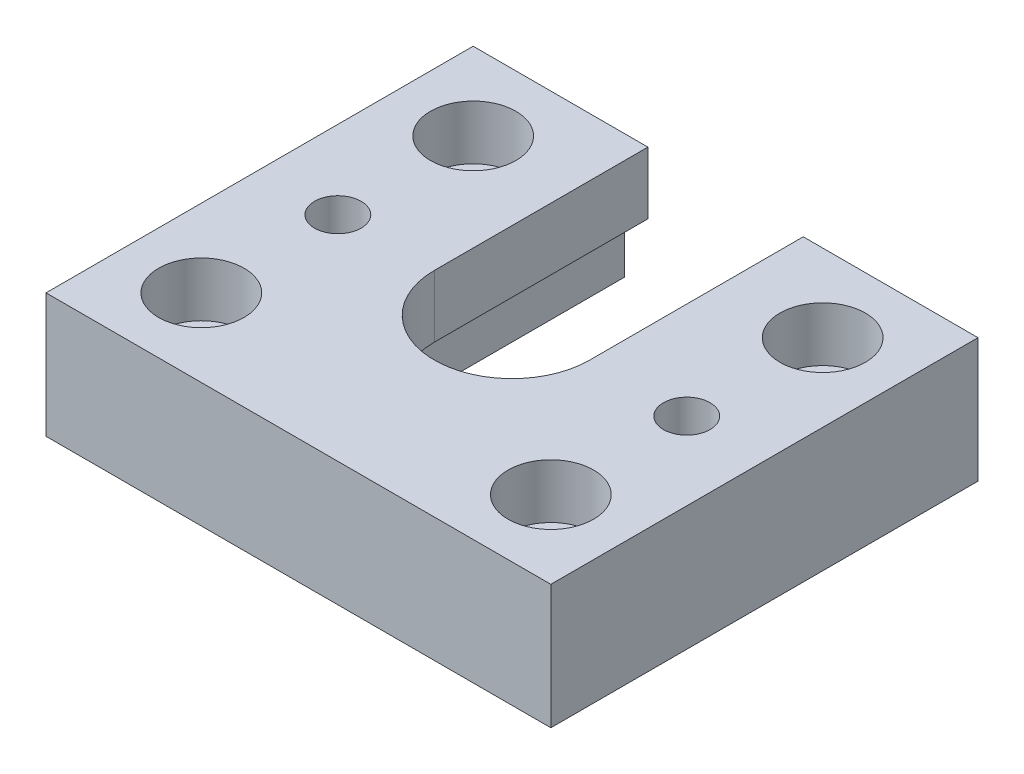
ISO-10303-21;
HEADER;
FILE_DESCRIPTION(('STEP AP214'),'2;1');
FILE_NAME('part.step','',(''),(''),'','','');
FILE_SCHEMA(('AUTOMOTIVE_DESIGN { 1 0 10303 214 1 1 1 1 }'));
ENDSEC;
DATA;
#1=APPLICATION_CONTEXT('core data for automotive mechanical design processes');
#2=APPLICATION_PROTOCOL_DEFINITION('international standard','automotive_design',2000,#1);
#3=PRODUCT_CONTEXT('',#1,'mechanical');
#4=PRODUCT('Part','Part','',(#3));
#5=PRODUCT_RELATED_PRODUCT_CATEGORY('part','',(#4));
#6=PRODUCT_DEFINITION_FORMATION('','',#4);
#7=PRODUCT_DEFINITION_CONTEXT('part definition',#1,'design');
#8=PRODUCT_DEFINITION('design','',#6,#7);
#9=PRODUCT_DEFINITION_SHAPE('','',#8);
#10=(LENGTH_UNIT() NAMED_UNIT(*) SI_UNIT(.MILLI.,.METRE.));
#11=(NAMED_UNIT(*) PLANE_ANGLE_UNIT() SI_UNIT($,.RADIAN.));
#12=(NAMED_UNIT(*) SI_UNIT($,.STERADIAN.) SOLID_ANGLE_UNIT());
#13=UNCERTAINTY_MEASURE_WITH_UNIT(LENGTH_MEASURE(1.E-05),#10,'distance_accuracy_value','');
#14=(GEOMETRIC_REPRESENTATION_CONTEXT(3) GLOBAL_UNCERTAINTY_ASSIGNED_CONTEXT((#13)) GLOBAL_UNIT_ASSIGNED_CONTEXT((#10,
#11,#12)) REPRESENTATION_CONTEXT('',''));
#15=CARTESIAN_POINT('',(0.,0.,0.));
#16=DIRECTION('',(0.,0.,1.));
#17=DIRECTION('',(1.,0.,0.));
#18=AXIS2_PLACEMENT_3D('',#15,#16,#17);
#19=CARTESIAN_POINT('',(0.,16.,-55.));
#20=DIRECTION('',(0.,0.,1.));
#21=DIRECTION('',(1.,0.,0.));
#22=AXIS2_PLACEMENT_3D('',#19,#20,#21);
#23=PLANE('',#22);
#24=DIRECTION('',(0.,-1.,0.));
#25=VECTOR('',#24,1.);
#26=CARTESIAN_POINT('',(42.5,16.,-55.));
#27=LINE('',#26,#25);
#28=CARTESIAN_POINT('',(42.5,16.,-55.));
#29=VERTEX_POINT('',#28);
#30=CARTESIAN_POINT('',(42.5,8.,-55.));
#31=VERTEX_POINT('',#30);
#32=EDGE_CURVE('E166',#29,#31,#27,.T.);
#33=ORIENTED_EDGE('',*,*,#32,.F.);
#34=DIRECTION('',(-1.,0.,0.));
#35=VECTOR('',#34,1.);
#36=CARTESIAN_POINT('',(0.,16.,-55.));
#37=LINE('',#36,#35);
#38=CARTESIAN_POINT('',(65.,16.,-55.));
#39=VERTEX_POINT('',#38);
#40=EDGE_CURVE('E303',#39,#29,#37,.T.);
#41=ORIENTED_EDGE('',*,*,#40,.F.);
#42=DIRECTION('',(0.,-1.,0.));
#43=VECTOR('',#42,1.);
#44=CARTESIAN_POINT('',(65.,16.,-55.));
#45=LINE('',#44,#43);
#46=CARTESIAN_POINT('',(65.,0.,-55.));
#47=VERTEX_POINT('',#46);
#48=EDGE_CURVE('E323',#39,#47,#45,.T.);
#49=ORIENTED_EDGE('',*,*,#48,.T.);
#50=DIRECTION('',(-1.,0.,0.));
#51=VECTOR('',#50,1.);
#52=CARTESIAN_POINT('',(0.,0.,-55.));
#53=LINE('',#52,#51);
#54=CARTESIAN_POINT('',(45.5,0.,-55.));
#55=VERTEX_POINT('',#54);
#56=EDGE_CURVE('E296',#47,#55,#53,.T.);
#57=ORIENTED_EDGE('',*,*,#56,.T.);
#58=DIRECTION('',(0.,-1.,0.));
#59=VECTOR('',#58,1.);
#60=CARTESIAN_POINT('',(45.5,8.,-55.));
#61=LINE('',#60,#59);
#62=CARTESIAN_POINT('',(45.5,8.,-55.));
#63=VERTEX_POINT('',#62);
#64=EDGE_CURVE('E198',#63,#55,#61,.T.);
#65=ORIENTED_EDGE('',*,*,#64,.F.);
#66=DIRECTION('',(1.,0.,0.));
#67=VECTOR('',#66,1.);
#68=CARTESIAN_POINT('',(0.,8.,-55.));
#69=LINE('',#68,#67);
#70=EDGE_CURVE('E184',#31,#63,#69,.T.);
#71=ORIENTED_EDGE('',*,*,#70,.F.);
#72=EDGE_LOOP('',(#33,#41,#49,#57,#65,#71));
#73=FACE_BOUND('',#72,.T.);
#74=ADVANCED_FACE('F39',(#73),#23,.F.);
#75=CARTESIAN_POINT('',(0.,16.,0.));
#76=DIRECTION('',(0.,-1.,0.));
#77=DIRECTION('',(0.,0.,-1.));
#78=AXIS2_PLACEMENT_3D('',#75,#76,#77);
#79=PLANE('',#78);
#80=CARTESIAN_POINT('',(10.,16.,-9.99999999999999));
#81=DIRECTION('',(0.,1.,0.));
#82=DIRECTION('',(0.,0.,1.));
#83=AXIS2_PLACEMENT_3D('',#80,#81,#82);
#84=CIRCLE('',#83,5.5);
#85=CARTESIAN_POINT('',(10.,16.,-4.5));
#86=VERTEX_POINT('',#85);
#87=EDGE_CURVE('E274',#86,#86,#84,.T.);
#88=ORIENTED_EDGE('',*,*,#87,.F.);
#89=EDGE_LOOP('',(#88));
#90=FACE_BOUND('',#89,.T.);
#91=CARTESIAN_POINT('',(55.,16.,-9.99999999999999));
#92=DIRECTION('',(0.,1.,0.));
#93=DIRECTION('',(0.,0.,1.));
#94=AXIS2_PLACEMENT_3D('',#91,#92,#93);
#95=CIRCLE('',#94,5.5);
#96=CARTESIAN_POINT('',(55.,16.,-4.5));
#97=VERTEX_POINT('',#96);
#98=EDGE_CURVE('E258',#97,#97,#95,.T.);
#99=ORIENTED_EDGE('',*,*,#98,.F.);
#100=EDGE_LOOP('',(#99));
#101=FACE_BOUND('',#100,.T.);
#102=CARTESIAN_POINT('',(55.,16.,-45.));
#103=DIRECTION('',(0.,1.,0.));
#104=DIRECTION('',(0.,0.,1.));
#105=AXIS2_PLACEMENT_3D('',#102,#103,#104);
#106=CIRCLE('',#105,5.5);
#107=CARTESIAN_POINT('',(55.,16.,-39.5));
#108=VERTEX_POINT('',#107);
#109=EDGE_CURVE('E242',#108,#108,#106,.T.);
#110=ORIENTED_EDGE('',*,*,#109,.F.);
#111=EDGE_LOOP('',(#110));
#112=FACE_BOUND('',#111,.T.);
#113=CARTESIAN_POINT('',(10.,16.,-45.));
#114=DIRECTION('',(0.,1.,0.));
#115=DIRECTION('',(0.,0.,1.));
#116=AXIS2_PLACEMENT_3D('',#113,#114,#115);
#117=CIRCLE('',#116,5.5);
#118=CARTESIAN_POINT('',(10.,16.,-39.5));
#119=VERTEX_POINT('',#118);
#120=EDGE_CURVE('E226',#119,#119,#117,.T.);
#121=ORIENTED_EDGE('',*,*,#120,.F.);
#122=EDGE_LOOP('',(#121));
#123=FACE_BOUND('',#122,.T.);
#124=CARTESIAN_POINT('',(55.,16.,-27.5));
#125=DIRECTION('',(0.,1.,0.));
#126=DIRECTION('',(0.,0.,1.));
#127=AXIS2_PLACEMENT_3D('',#124,#125,#126);
#128=CIRCLE('',#127,3.);
#129=CARTESIAN_POINT('',(55.,16.,-24.5));
#130=VERTEX_POINT('',#129);
#131=EDGE_CURVE('E218',#130,#130,#128,.T.);
#132=ORIENTED_EDGE('',*,*,#131,.F.);
#133=EDGE_LOOP('',(#132));
#134=FACE_BOUND('',#133,.T.);
#135=CARTESIAN_POINT('',(10.0781163253014,16.,-27.5));
#136=DIRECTION('',(0.,1.,0.));
#137=DIRECTION('',(0.,0.,1.));
#138=AXIS2_PLACEMENT_3D('',#135,#136,#137);
#139=CIRCLE('',#138,3.);
#140=CARTESIAN_POINT('',(10.0781163253014,16.,-24.5));
#141=VERTEX_POINT('',#140);
#142=EDGE_CURVE('E201',#141,#141,#139,.T.);
#143=ORIENTED_EDGE('',*,*,#142,.F.);
#144=EDGE_LOOP('',(#143));
#145=FACE_BOUND('',#144,.T.);
#146=DIRECTION('',(0.,0.,-1.));
#147=VECTOR('',#146,1.);
#148=CARTESIAN_POINT('',(42.5,16.,0.));
#149=LINE('',#148,#147);
#150=CARTESIAN_POINT('',(42.5,16.,-27.5));
#151=VERTEX_POINT('',#150);
#152=EDGE_CURVE('E137',#151,#29,#149,.T.);
#153=ORIENTED_EDGE('',*,*,#152,.F.);
#154=CARTESIAN_POINT('',(32.5,16.,-27.5));
#155=DIRECTION('',(0.,-1.,0.));
#156=DIRECTION('',(0.,0.,-1.));
#157=AXIS2_PLACEMENT_3D('',#154,#155,#156);
#158=CIRCLE('',#157,10.);
#159=CARTESIAN_POINT('',(22.5,16.,-27.5));
#160=VERTEX_POINT('',#159);
#161=EDGE_CURVE('E131',#151,#160,#158,.T.);
#162=ORIENTED_EDGE('',*,*,#161,.T.);
#163=DIRECTION('',(0.,0.,-1.));
#164=VECTOR('',#163,1.);
#165=CARTESIAN_POINT('',(22.5,16.,0.));
#166=LINE('',#165,#164);
#167=CARTESIAN_POINT('',(22.5,16.,-55.));
#168=VERTEX_POINT('',#167);
#169=EDGE_CURVE('E140',#160,#168,#166,.T.);
#170=ORIENTED_EDGE('',*,*,#169,.T.);
#171=CARTESIAN_POINT('',(0.,16.,-55.));
#172=VERTEX_POINT('',#171);
#173=EDGE_CURVE('E302',#168,#172,#37,.T.);
#174=ORIENTED_EDGE('',*,*,#173,.T.);
#175=DIRECTION('',(0.,0.,1.));
#176=VECTOR('',#175,1.);
#177=CARTESIAN_POINT('',(0.,16.,0.));
#178=LINE('',#177,#176);
#179=CARTESIAN_POINT('',(0.,16.,0.));
#180=VERTEX_POINT('',#179);
#181=EDGE_CURVE('E291',#172,#180,#178,.T.);
#182=ORIENTED_EDGE('',*,*,#181,.T.);
#183=DIRECTION('',(1.,0.,0.));
#184=VECTOR('',#183,1.);
#185=CARTESIAN_POINT('',(0.,16.,0.));
#186=LINE('',#185,#184);
#187=CARTESIAN_POINT('',(65.,16.,0.));
#188=VERTEX_POINT('',#187);
#189=EDGE_CURVE('E295',#180,#188,#186,.T.);
#190=ORIENTED_EDGE('',*,*,#189,.T.);
#191=DIRECTION('',(0.,0.,-1.));
#192=VECTOR('',#191,1.);
#193=CARTESIAN_POINT('',(65.,16.,0.));
#194=LINE('',#193,#192);
#195=EDGE_CURVE('E299',#188,#39,#194,.T.);
#196=ORIENTED_EDGE('',*,*,#195,.T.);
#197=ORIENTED_EDGE('',*,*,#40,.T.);
#198=EDGE_LOOP('',(#153,#162,#170,#174,#182,#190,#196,#197));
#199=FACE_BOUND('',#198,.T.);
#200=ADVANCED_FACE('F147',(#90,#101,#112,#123,#134,#145,#199),#79,.F.);
#201=CARTESIAN_POINT('',(0.,8.,0.));
#202=DIRECTION('',(0.,-1.,0.));
#203=DIRECTION('',(0.,0.,-1.));
#204=AXIS2_PLACEMENT_3D('',#201,#202,#203);
#205=PLANE('',#204);
#206=CARTESIAN_POINT('',(32.5,8.,-27.5));
#207=DIRECTION('',(0.,-1.,0.));
#208=DIRECTION('',(0.,0.,-1.));
#209=AXIS2_PLACEMENT_3D('',#206,#207,#208);
#210=CIRCLE('',#209,10.);
#211=CARTESIAN_POINT('',(42.5,8.,-27.5));
#212=VERTEX_POINT('',#211);
#213=CARTESIAN_POINT('',(22.5,8.,-27.5));
#214=VERTEX_POINT('',#213);
#215=EDGE_CURVE('E55',#212,#214,#210,.T.);
#216=ORIENTED_EDGE('',*,*,#215,.F.);
#217=DIRECTION('',(0.,0.,-1.));
#218=VECTOR('',#217,1.);
#219=CARTESIAN_POINT('',(42.5,8.,0.));
#220=LINE('',#219,#218);
#221=EDGE_CURVE('E150',#212,#31,#220,.T.);
#222=ORIENTED_EDGE('',*,*,#221,.T.);
#223=ORIENTED_EDGE('',*,*,#70,.T.);
#224=DIRECTION('',(0.,0.,-1.));
#225=VECTOR('',#224,1.);
#226=CARTESIAN_POINT('',(45.5,8.,0.));
#227=LINE('',#226,#225);
#228=CARTESIAN_POINT('',(45.5,8.,-27.5));
#229=VERTEX_POINT('',#228);
#230=EDGE_CURVE('E171',#229,#63,#227,.T.);
#231=ORIENTED_EDGE('',*,*,#230,.F.);
#232=CARTESIAN_POINT('',(32.5,8.,-27.5));
#233=DIRECTION('',(0.,-1.,0.));
#234=DIRECTION('',(0.,0.,-1.));
#235=AXIS2_PLACEMENT_3D('',#232,#233,#234);
#236=CIRCLE('',#235,13.);
#237=CARTESIAN_POINT('',(19.5,8.,-27.5));
#238=VERTEX_POINT('',#237);
#239=EDGE_CURVE('E175',#229,#238,#236,.T.);
#240=ORIENTED_EDGE('',*,*,#239,.T.);
#241=DIRECTION('',(0.,0.,-1.));
#242=VECTOR('',#241,1.);
#243=CARTESIAN_POINT('',(19.5,8.,0.));
#244=LINE('',#243,#242);
#245=CARTESIAN_POINT('',(19.5,8.,-55.));
#246=VERTEX_POINT('',#245);
#247=EDGE_CURVE('E180',#238,#246,#244,.T.);
#248=ORIENTED_EDGE('',*,*,#247,.T.);
#249=CARTESIAN_POINT('',(22.5,8.,-55.));
#250=VERTEX_POINT('',#249);
#251=EDGE_CURVE('E185',#246,#250,#69,.T.);
#252=ORIENTED_EDGE('',*,*,#251,.T.);
#253=DIRECTION('',(0.,0.,-1.));
#254=VECTOR('',#253,1.);
#255=CARTESIAN_POINT('',(22.5,8.,0.));
#256=LINE('',#255,#254);
#257=EDGE_CURVE('E154',#214,#250,#256,.T.);
#258=ORIENTED_EDGE('',*,*,#257,.F.);
#259=EDGE_LOOP('',(#216,#222,#223,#231,#240,#248,#252,#258));
#260=FACE_BOUND('',#259,.T.);
#261=ADVANCED_FACE('F357',(#260),#205,.T.);
#262=ORIENTED_EDGE('',*,*,#173,.F.);
#263=DIRECTION('',(0.,-1.,0.));
#264=VECTOR('',#263,1.);
#265=CARTESIAN_POINT('',(22.5,16.,-55.));
#266=LINE('',#265,#264);
#267=EDGE_CURVE('E136',#168,#250,#266,.T.);
#268=ORIENTED_EDGE('',*,*,#267,.T.);
#269=ORIENTED_EDGE('',*,*,#251,.F.);
#270=DIRECTION('',(0.,-1.,0.));
#271=VECTOR('',#270,1.);
#272=CARTESIAN_POINT('',(19.5,8.,-55.));
#273=LINE('',#272,#271);
#274=CARTESIAN_POINT('',(19.5,0.,-55.));
#275=VERTEX_POINT('',#274);
#276=EDGE_CURVE('E202',#246,#275,#273,.T.);
#277=ORIENTED_EDGE('',*,*,#276,.T.);
#278=CARTESIAN_POINT('',(0.,0.,-55.));
#279=VERTEX_POINT('',#278);
#280=EDGE_CURVE('E316',#275,#279,#53,.T.);
#281=ORIENTED_EDGE('',*,*,#280,.T.);
#282=DIRECTION('',(0.,-1.,0.));
#283=VECTOR('',#282,1.);
#284=CARTESIAN_POINT('',(0.,16.,-55.));
#285=LINE('',#284,#283);
#286=EDGE_CURVE('E306',#172,#279,#285,.T.);
#287=ORIENTED_EDGE('',*,*,#286,.F.);
#288=EDGE_LOOP('',(#262,#268,#269,#277,#281,#287));
#289=FACE_BOUND('',#288,.T.);
#290=ADVANCED_FACE('F366',(#289),#23,.F.);
#291=CARTESIAN_POINT('',(0.,0.,0.));
#292=DIRECTION('',(0.,-1.,0.));
#293=DIRECTION('',(0.,0.,-1.));
#294=AXIS2_PLACEMENT_3D('',#291,#292,#293);
#295=PLANE('',#294);
#296=CARTESIAN_POINT('',(10.0781163253014,0.,-27.5));
#297=DIRECTION('',(0.,1.,0.));
#298=DIRECTION('',(0.,0.,1.));
#299=AXIS2_PLACEMENT_3D('',#296,#297,#298);
#300=CIRCLE('',#299,3.);
#301=CARTESIAN_POINT('',(10.0781163253014,0.,-24.5));
#302=VERTEX_POINT('',#301);
#303=EDGE_CURVE('E214',#302,#302,#300,.T.);
#304=ORIENTED_EDGE('',*,*,#303,.T.);
#305=EDGE_LOOP('',(#304));
#306=FACE_BOUND('',#305,.T.);
#307=CARTESIAN_POINT('',(55.,0.,-27.5));
#308=DIRECTION('',(0.,1.,0.));
#309=DIRECTION('',(0.,0.,1.));
#310=AXIS2_PLACEMENT_3D('',#307,#308,#309);
#311=CIRCLE('',#310,3.);
#312=CARTESIAN_POINT('',(55.,0.,-24.5));
#313=VERTEX_POINT('',#312);
#314=EDGE_CURVE('E222',#313,#313,#311,.T.);
#315=ORIENTED_EDGE('',*,*,#314,.T.);
#316=EDGE_LOOP('',(#315));
#317=FACE_BOUND('',#316,.T.);
#318=CARTESIAN_POINT('',(10.,0.,-45.));
#319=DIRECTION('',(0.,1.,0.));
#320=DIRECTION('',(0.,0.,1.));
#321=AXIS2_PLACEMENT_3D('',#318,#319,#320);
#322=CIRCLE('',#321,3.3);
#323=CARTESIAN_POINT('',(10.,0.,-41.7));
#324=VERTEX_POINT('',#323);
#325=EDGE_CURVE('E238',#324,#324,#322,.T.);
#326=ORIENTED_EDGE('',*,*,#325,.T.);
#327=EDGE_LOOP('',(#326));
#328=FACE_BOUND('',#327,.T.);
#329=CARTESIAN_POINT('',(55.,0.,-45.));
#330=DIRECTION('',(0.,1.,0.));
#331=DIRECTION('',(0.,0.,1.));
#332=AXIS2_PLACEMENT_3D('',#329,#330,#331);
#333=CIRCLE('',#332,3.3);
#334=CARTESIAN_POINT('',(55.,0.,-41.7));
#335=VERTEX_POINT('',#334);
#336=EDGE_CURVE('E254',#335,#335,#333,.T.);
#337=ORIENTED_EDGE('',*,*,#336,.T.);
#338=EDGE_LOOP('',(#337));
#339=FACE_BOUND('',#338,.T.);
#340=CARTESIAN_POINT('',(55.,0.,-9.99999999999999));
#341=DIRECTION('',(0.,1.,0.));
#342=DIRECTION('',(0.,0.,1.));
#343=AXIS2_PLACEMENT_3D('',#340,#341,#342);
#344=CIRCLE('',#343,3.3);
#345=CARTESIAN_POINT('',(55.,0.,-6.7));
#346=VERTEX_POINT('',#345);
#347=EDGE_CURVE('E270',#346,#346,#344,.T.);
#348=ORIENTED_EDGE('',*,*,#347,.T.);
#349=EDGE_LOOP('',(#348));
#350=FACE_BOUND('',#349,.T.);
#351=CARTESIAN_POINT('',(10.,0.,-9.99999999999999));
#352=DIRECTION('',(0.,1.,0.));
#353=DIRECTION('',(0.,0.,1.));
#354=AXIS2_PLACEMENT_3D('',#351,#352,#353);
#355=CIRCLE('',#354,3.3);
#356=CARTESIAN_POINT('',(10.,0.,-6.7));
#357=VERTEX_POINT('',#356);
#358=EDGE_CURVE('E286',#357,#357,#355,.T.);
#359=ORIENTED_EDGE('',*,*,#358,.T.);
#360=EDGE_LOOP('',(#359));
#361=FACE_BOUND('',#360,.T.);
#362=CARTESIAN_POINT('',(32.5,0.,-27.5));
#363=DIRECTION('',(0.,-1.,0.));
#364=DIRECTION('',(0.,0.,-1.));
#365=AXIS2_PLACEMENT_3D('',#362,#363,#364);
#366=CIRCLE('',#365,13.);
#367=CARTESIAN_POINT('',(45.5,0.,-27.5));
#368=VERTEX_POINT('',#367);
#369=CARTESIAN_POINT('',(19.5,0.,-27.5));
#370=VERTEX_POINT('',#369);
#371=EDGE_CURVE('E192',#368,#370,#366,.T.);
#372=ORIENTED_EDGE('',*,*,#371,.F.);
#373=DIRECTION('',(0.,0.,-1.));
#374=VECTOR('',#373,1.);
#375=CARTESIAN_POINT('',(45.5,0.,0.));
#376=LINE('',#375,#374);
#377=EDGE_CURVE('E63',#368,#55,#376,.T.);
#378=ORIENTED_EDGE('',*,*,#377,.T.);
#379=ORIENTED_EDGE('',*,*,#56,.F.);
#380=DIRECTION('',(0.,0.,-1.));
#381=VECTOR('',#380,1.);
#382=CARTESIAN_POINT('',(65.,0.,0.));
#383=LINE('',#382,#381);
#384=CARTESIAN_POINT('',(65.,0.,0.));
#385=VERTEX_POINT('',#384);
#386=EDGE_CURVE('E313',#385,#47,#383,.T.);
#387=ORIENTED_EDGE('',*,*,#386,.F.);
#388=DIRECTION('',(1.,0.,0.));
#389=VECTOR('',#388,1.);
#390=CARTESIAN_POINT('',(0.,0.,0.));
#391=LINE('',#390,#389);
#392=CARTESIAN_POINT('',(0.,0.,0.));
#393=VERTEX_POINT('',#392);
#394=EDGE_CURVE('E310',#393,#385,#391,.T.);
#395=ORIENTED_EDGE('',*,*,#394,.F.);
#396=DIRECTION('',(0.,0.,1.));
#397=VECTOR('',#396,1.);
#398=CARTESIAN_POINT('',(0.,0.,0.));
#399=LINE('',#398,#397);
#400=EDGE_CURVE('E290',#279,#393,#399,.T.);
#401=ORIENTED_EDGE('',*,*,#400,.F.);
#402=ORIENTED_EDGE('',*,*,#280,.F.);
#403=DIRECTION('',(0.,0.,-1.));
#404=VECTOR('',#403,1.);
#405=CARTESIAN_POINT('',(19.5,0.,0.));
#406=LINE('',#405,#404);
#407=EDGE_CURVE('E176',#370,#275,#406,.T.);
#408=ORIENTED_EDGE('',*,*,#407,.F.);
#409=EDGE_LOOP('',(#372,#378,#379,#387,#395,#401,#402,#408));
#410=FACE_BOUND('',#409,.T.);
#411=ADVANCED_FACE('F338',(#306,#317,#328,#339,#350,#361,#410),#295,.T.);
#412=CARTESIAN_POINT('',(0.,16.,0.));
#413=DIRECTION('',(1.,0.,0.));
#414=DIRECTION('',(0.,0.,-1.));
#415=AXIS2_PLACEMENT_3D('',#412,#413,#414);
#416=PLANE('',#415);
#417=ORIENTED_EDGE('',*,*,#400,.T.);
#418=DIRECTION('',(0.,-1.,0.));
#419=VECTOR('',#418,1.);
#420=CARTESIAN_POINT('',(0.,16.,0.));
#421=LINE('',#420,#419);
#422=EDGE_CURVE('E11',#180,#393,#421,.T.);
#423=ORIENTED_EDGE('',*,*,#422,.F.);
#424=ORIENTED_EDGE('',*,*,#181,.F.);
#425=ORIENTED_EDGE('',*,*,#286,.T.);
#426=EDGE_LOOP('',(#417,#423,#424,#425));
#427=FACE_BOUND('',#426,.T.);
#428=ADVANCED_FACE('F41',(#427),#416,.F.);
#429=CARTESIAN_POINT('',(0.,16.,0.));
#430=DIRECTION('',(0.,0.,-1.));
#431=DIRECTION('',(-1.,0.,0.));
#432=AXIS2_PLACEMENT_3D('',#429,#430,#431);
#433=PLANE('',#432);
#434=ORIENTED_EDGE('',*,*,#394,.T.);
#435=DIRECTION('',(0.,-1.,0.));
#436=VECTOR('',#435,1.);
#437=CARTESIAN_POINT('',(65.,16.,0.));
#438=LINE('',#437,#436);
#439=EDGE_CURVE('E48',#188,#385,#438,.T.);
#440=ORIENTED_EDGE('',*,*,#439,.F.);
#441=ORIENTED_EDGE('',*,*,#189,.F.);
#442=ORIENTED_EDGE('',*,*,#422,.T.);
#443=EDGE_LOOP('',(#434,#440,#441,#442));
#444=FACE_BOUND('',#443,.T.);
#445=ADVANCED_FACE('F347',(#444),#433,.F.);
#446=CARTESIAN_POINT('',(65.,16.,0.));
#447=DIRECTION('',(-1.,0.,0.));
#448=DIRECTION('',(0.,0.,1.));
#449=AXIS2_PLACEMENT_3D('',#446,#447,#448);
#450=PLANE('',#449);
#451=ORIENTED_EDGE('',*,*,#386,.T.);
#452=ORIENTED_EDGE('',*,*,#48,.F.);
#453=ORIENTED_EDGE('',*,*,#195,.F.);
#454=ORIENTED_EDGE('',*,*,#439,.T.);
#455=EDGE_LOOP('',(#451,#452,#453,#454));
#456=FACE_BOUND('',#455,.T.);
#457=ADVANCED_FACE('F332',(#456),#450,.F.);
#458=CARTESIAN_POINT('',(10.,16.,-9.99999999999999));
#459=DIRECTION('',(0.,1.,0.));
#460=DIRECTION('',(0.,0.,1.));
#461=AXIS2_PLACEMENT_3D('',#458,#459,#460);
#462=CYLINDRICAL_SURFACE('',#461,3.3);
#463=ORIENTED_EDGE('',*,*,#358,.F.);
#464=EDGE_LOOP('',(#463));
#465=FACE_BOUND('',#464,.T.);
#466=CARTESIAN_POINT('',(10.,9.,-9.99999999999999));
#467=DIRECTION('',(0.,1.,0.));
#468=DIRECTION('',(0.,0.,1.));
#469=AXIS2_PLACEMENT_3D('',#466,#467,#468);
#470=CIRCLE('',#469,3.3);
#471=CARTESIAN_POINT('',(10.,9.,-6.7));
#472=VERTEX_POINT('',#471);
#473=EDGE_CURVE('E282',#472,#472,#470,.T.);
#474=ORIENTED_EDGE('',*,*,#473,.T.);
#475=EDGE_LOOP('',(#474));
#476=FACE_BOUND('',#475,.T.);
#477=ADVANCED_FACE('F590',(#465,#476),#462,.F.);
#478=CARTESIAN_POINT('',(13.3,9.,-9.99999999999999));
#479=DIRECTION('',(0.,-1.,0.));
#480=DIRECTION('',(0.,0.,-1.));
#481=AXIS2_PLACEMENT_3D('',#478,#479,#480);
#482=PLANE('',#481);
#483=ORIENTED_EDGE('',*,*,#473,.F.);
#484=EDGE_LOOP('',(#483));
#485=FACE_BOUND('',#484,.T.);
#486=CARTESIAN_POINT('',(10.,9.,-9.99999999999999));
#487=DIRECTION('',(0.,1.,0.));
#488=DIRECTION('',(0.,0.,1.));
#489=AXIS2_PLACEMENT_3D('',#486,#487,#488);
#490=CIRCLE('',#489,5.5);
#491=CARTESIAN_POINT('',(10.,9.,-4.5));
#492=VERTEX_POINT('',#491);
#493=EDGE_CURVE('E278',#492,#492,#490,.T.);
#494=ORIENTED_EDGE('',*,*,#493,.T.);
#495=EDGE_LOOP('',(#494));
#496=FACE_BOUND('',#495,.T.);
#497=ADVANCED_FACE('F580',(#485,#496),#482,.F.);
#498=CARTESIAN_POINT('',(10.,16.,-9.99999999999999));
#499=DIRECTION('',(0.,1.,0.));
#500=DIRECTION('',(0.,0.,1.));
#501=AXIS2_PLACEMENT_3D('',#498,#499,#500);
#502=CYLINDRICAL_SURFACE('',#501,5.5);
#503=ORIENTED_EDGE('',*,*,#493,.F.);
#504=EDGE_LOOP('',(#503));
#505=FACE_BOUND('',#504,.T.);
#506=ORIENTED_EDGE('',*,*,#87,.T.);
#507=EDGE_LOOP('',(#506));
#508=FACE_BOUND('',#507,.T.);
#509=ADVANCED_FACE('F570',(#505,#508),#502,.F.);
#510=CARTESIAN_POINT('',(55.,16.,-9.99999999999999));
#511=DIRECTION('',(0.,1.,0.));
#512=DIRECTION('',(0.,0.,1.));
#513=AXIS2_PLACEMENT_3D('',#510,#511,#512);
#514=CYLINDRICAL_SURFACE('',#513,3.3);
#515=ORIENTED_EDGE('',*,*,#347,.F.);
#516=EDGE_LOOP('',(#515));
#517=FACE_BOUND('',#516,.T.);
#518=CARTESIAN_POINT('',(55.,9.,-9.99999999999999));
#519=DIRECTION('',(0.,1.,0.));
#520=DIRECTION('',(0.,0.,1.));
#521=AXIS2_PLACEMENT_3D('',#518,#519,#520);
#522=CIRCLE('',#521,3.3);
#523=CARTESIAN_POINT('',(55.,9.,-6.7));
#524=VERTEX_POINT('',#523);
#525=EDGE_CURVE('E266',#524,#524,#522,.T.);
#526=ORIENTED_EDGE('',*,*,#525,.T.);
#527=EDGE_LOOP('',(#526));
#528=FACE_BOUND('',#527,.T.);
#529=ADVANCED_FACE('F560',(#517,#528),#514,.F.);
#530=CARTESIAN_POINT('',(58.3,9.,-9.99999999999999));
#531=DIRECTION('',(0.,-1.,0.));
#532=DIRECTION('',(0.,0.,-1.));
#533=AXIS2_PLACEMENT_3D('',#530,#531,#532);
#534=PLANE('',#533);
#535=ORIENTED_EDGE('',*,*,#525,.F.);
#536=EDGE_LOOP('',(#535));
#537=FACE_BOUND('',#536,.T.);
#538=CARTESIAN_POINT('',(55.,9.,-9.99999999999999));
#539=DIRECTION('',(0.,1.,0.));
#540=DIRECTION('',(0.,0.,1.));
#541=AXIS2_PLACEMENT_3D('',#538,#539,#540);
#542=CIRCLE('',#541,5.5);
#543=CARTESIAN_POINT('',(55.,9.,-4.5));
#544=VERTEX_POINT('',#543);
#545=EDGE_CURVE('E262',#544,#544,#542,.T.);
#546=ORIENTED_EDGE('',*,*,#545,.T.);
#547=EDGE_LOOP('',(#546));
#548=FACE_BOUND('',#547,.T.);
#549=ADVANCED_FACE('F550',(#537,#548),#534,.F.);
#550=CARTESIAN_POINT('',(55.,16.,-9.99999999999999));
#551=DIRECTION('',(0.,1.,0.));
#552=DIRECTION('',(0.,0.,1.));
#553=AXIS2_PLACEMENT_3D('',#550,#551,#552);
#554=CYLINDRICAL_SURFACE('',#553,5.5);
#555=ORIENTED_EDGE('',*,*,#545,.F.);
#556=EDGE_LOOP('',(#555));
#557=FACE_BOUND('',#556,.T.);
#558=ORIENTED_EDGE('',*,*,#98,.T.);
#559=EDGE_LOOP('',(#558));
#560=FACE_BOUND('',#559,.T.);
#561=ADVANCED_FACE('F540',(#557,#560),#554,.F.);
#562=CARTESIAN_POINT('',(55.,16.,-45.));
#563=DIRECTION('',(0.,1.,0.));
#564=DIRECTION('',(0.,0.,1.));
#565=AXIS2_PLACEMENT_3D('',#562,#563,#564);
#566=CYLINDRICAL_SURFACE('',#565,3.3);
#567=ORIENTED_EDGE('',*,*,#336,.F.);
#568=EDGE_LOOP('',(#567));
#569=FACE_BOUND('',#568,.T.);
#570=CARTESIAN_POINT('',(55.,9.,-45.));
#571=DIRECTION('',(0.,1.,0.));
#572=DIRECTION('',(0.,0.,1.));
#573=AXIS2_PLACEMENT_3D('',#570,#571,#572);
#574=CIRCLE('',#573,3.3);
#575=CARTESIAN_POINT('',(55.,9.,-41.7));
#576=VERTEX_POINT('',#575);
#577=EDGE_CURVE('E250',#576,#576,#574,.T.);
#578=ORIENTED_EDGE('',*,*,#577,.T.);
#579=EDGE_LOOP('',(#578));
#580=FACE_BOUND('',#579,.T.);
#581=ADVANCED_FACE('F530',(#569,#580),#566,.F.);
#582=CARTESIAN_POINT('',(58.3,9.,-45.));
#583=DIRECTION('',(0.,-1.,0.));
#584=DIRECTION('',(0.,0.,-1.));
#585=AXIS2_PLACEMENT_3D('',#582,#583,#584);
#586=PLANE('',#585);
#587=ORIENTED_EDGE('',*,*,#577,.F.);
#588=EDGE_LOOP('',(#587));
#589=FACE_BOUND('',#588,.T.);
#590=CARTESIAN_POINT('',(55.,9.,-45.));
#591=DIRECTION('',(0.,1.,0.));
#592=DIRECTION('',(0.,0.,1.));
#593=AXIS2_PLACEMENT_3D('',#590,#591,#592);
#594=CIRCLE('',#593,5.5);
#595=CARTESIAN_POINT('',(55.,9.,-39.5));
#596=VERTEX_POINT('',#595);
#597=EDGE_CURVE('E246',#596,#596,#594,.T.);
#598=ORIENTED_EDGE('',*,*,#597,.T.);
#599=EDGE_LOOP('',(#598));
#600=FACE_BOUND('',#599,.T.);
#601=ADVANCED_FACE('F520',(#589,#600),#586,.F.);
#602=CARTESIAN_POINT('',(55.,16.,-45.));
#603=DIRECTION('',(0.,1.,0.));
#604=DIRECTION('',(0.,0.,1.));
#605=AXIS2_PLACEMENT_3D('',#602,#603,#604);
#606=CYLINDRICAL_SURFACE('',#605,5.5);
#607=ORIENTED_EDGE('',*,*,#597,.F.);
#608=EDGE_LOOP('',(#607));
#609=FACE_BOUND('',#608,.T.);
#610=ORIENTED_EDGE('',*,*,#109,.T.);
#611=EDGE_LOOP('',(#610));
#612=FACE_BOUND('',#611,.T.);
#613=ADVANCED_FACE('F510',(#609,#612),#606,.F.);
#614=CARTESIAN_POINT('',(10.,16.,-45.));
#615=DIRECTION('',(0.,1.,0.));
#616=DIRECTION('',(0.,0.,1.));
#617=AXIS2_PLACEMENT_3D('',#614,#615,#616);
#618=CYLINDRICAL_SURFACE('',#617,3.3);
#619=ORIENTED_EDGE('',*,*,#325,.F.);
#620=EDGE_LOOP('',(#619));
#621=FACE_BOUND('',#620,.T.);
#622=CARTESIAN_POINT('',(10.,9.,-45.));
#623=DIRECTION('',(0.,1.,0.));
#624=DIRECTION('',(0.,0.,1.));
#625=AXIS2_PLACEMENT_3D('',#622,#623,#624);
#626=CIRCLE('',#625,3.3);
#627=CARTESIAN_POINT('',(10.,9.,-41.7));
#628=VERTEX_POINT('',#627);
#629=EDGE_CURVE('E234',#628,#628,#626,.T.);
#630=ORIENTED_EDGE('',*,*,#629,.T.);
#631=EDGE_LOOP('',(#630));
#632=FACE_BOUND('',#631,.T.);
#633=ADVANCED_FACE('F500',(#621,#632),#618,.F.);
#634=CARTESIAN_POINT('',(13.3,9.,-45.));
#635=DIRECTION('',(0.,-1.,0.));
#636=DIRECTION('',(0.,0.,-1.));
#637=AXIS2_PLACEMENT_3D('',#634,#635,#636);
#638=PLANE('',#637);
#639=ORIENTED_EDGE('',*,*,#629,.F.);
#640=EDGE_LOOP('',(#639));
#641=FACE_BOUND('',#640,.T.);
#642=CARTESIAN_POINT('',(10.,9.,-45.));
#643=DIRECTION('',(0.,1.,0.));
#644=DIRECTION('',(0.,0.,1.));
#645=AXIS2_PLACEMENT_3D('',#642,#643,#644);
#646=CIRCLE('',#645,5.5);
#647=CARTESIAN_POINT('',(10.,9.,-39.5));
#648=VERTEX_POINT('',#647);
#649=EDGE_CURVE('E230',#648,#648,#646,.T.);
#650=ORIENTED_EDGE('',*,*,#649,.T.);
#651=EDGE_LOOP('',(#650));
#652=FACE_BOUND('',#651,.T.);
#653=ADVANCED_FACE('F490',(#641,#652),#638,.F.);
#654=CARTESIAN_POINT('',(10.,16.,-45.));
#655=DIRECTION('',(0.,1.,0.));
#656=DIRECTION('',(0.,0.,1.));
#657=AXIS2_PLACEMENT_3D('',#654,#655,#656);
#658=CYLINDRICAL_SURFACE('',#657,5.5);
#659=ORIENTED_EDGE('',*,*,#649,.F.);
#660=EDGE_LOOP('',(#659));
#661=FACE_BOUND('',#660,.T.);
#662=ORIENTED_EDGE('',*,*,#120,.T.);
#663=EDGE_LOOP('',(#662));
#664=FACE_BOUND('',#663,.T.);
#665=ADVANCED_FACE('F480',(#661,#664),#658,.F.);
#666=CARTESIAN_POINT('',(55.,16.,-27.5));
#667=DIRECTION('',(0.,1.,0.));
#668=DIRECTION('',(0.,0.,1.));
#669=AXIS2_PLACEMENT_3D('',#666,#667,#668);
#670=CYLINDRICAL_SURFACE('',#669,3.);
#671=ORIENTED_EDGE('',*,*,#314,.F.);
#672=EDGE_LOOP('',(#671));
#673=FACE_BOUND('',#672,.T.);
#674=ORIENTED_EDGE('',*,*,#131,.T.);
#675=EDGE_LOOP('',(#674));
#676=FACE_BOUND('',#675,.T.);
#677=ADVANCED_FACE('F470',(#673,#676),#670,.F.);
#678=CARTESIAN_POINT('',(10.0781163253014,16.,-27.5));
#679=DIRECTION('',(0.,1.,0.));
#680=DIRECTION('',(0.,0.,1.));
#681=AXIS2_PLACEMENT_3D('',#678,#679,#680);
#682=CYLINDRICAL_SURFACE('',#681,3.);
#683=ORIENTED_EDGE('',*,*,#303,.F.);
#684=EDGE_LOOP('',(#683));
#685=FACE_BOUND('',#684,.T.);
#686=ORIENTED_EDGE('',*,*,#142,.T.);
#687=EDGE_LOOP('',(#686));
#688=FACE_BOUND('',#687,.T.);
#689=ADVANCED_FACE('F376',(#685,#688),#682,.F.);
#690=CARTESIAN_POINT('',(45.5,8.,0.));
#691=DIRECTION('',(-1.,0.,0.));
#692=DIRECTION('',(0.,0.,1.));
#693=AXIS2_PLACEMENT_3D('',#690,#691,#692);
#694=PLANE('',#693);
#695=ORIENTED_EDGE('',*,*,#377,.F.);
#696=DIRECTION('',(0.,-1.,0.));
#697=VECTOR('',#696,1.);
#698=CARTESIAN_POINT('',(45.5,8.,-27.5));
#699=LINE('',#698,#697);
#700=EDGE_CURVE('E189',#229,#368,#699,.T.);
#701=ORIENTED_EDGE('',*,*,#700,.F.);
#702=ORIENTED_EDGE('',*,*,#230,.T.);
#703=ORIENTED_EDGE('',*,*,#64,.T.);
#704=EDGE_LOOP('',(#695,#701,#702,#703));
#705=FACE_BOUND('',#704,.T.);
#706=ADVANCED_FACE('F360',(#705),#694,.T.);
#707=CARTESIAN_POINT('',(19.5,8.,0.));
#708=DIRECTION('',(-1.,0.,0.));
#709=DIRECTION('',(0.,0.,1.));
#710=AXIS2_PLACEMENT_3D('',#707,#708,#709);
#711=PLANE('',#710);
#712=ORIENTED_EDGE('',*,*,#407,.T.);
#713=ORIENTED_EDGE('',*,*,#276,.F.);
#714=ORIENTED_EDGE('',*,*,#247,.F.);
#715=DIRECTION('',(0.,-1.,0.));
#716=VECTOR('',#715,1.);
#717=CARTESIAN_POINT('',(19.5,8.,-27.5));
#718=LINE('',#717,#716);
#719=EDGE_CURVE('E206',#238,#370,#718,.T.);
#720=ORIENTED_EDGE('',*,*,#719,.T.);
#721=EDGE_LOOP('',(#712,#713,#714,#720));
#722=FACE_BOUND('',#721,.T.);
#723=ADVANCED_FACE('F368',(#722),#711,.F.);
#724=CARTESIAN_POINT('',(32.5,8.,-27.5));
#725=DIRECTION('',(0.,-1.,0.));
#726=DIRECTION('',(0.,0.,-1.));
#727=AXIS2_PLACEMENT_3D('',#724,#725,#726);
#728=CYLINDRICAL_SURFACE('',#727,13.);
#729=ORIENTED_EDGE('',*,*,#371,.T.);
#730=ORIENTED_EDGE('',*,*,#719,.F.);
#731=ORIENTED_EDGE('',*,*,#239,.F.);
#732=ORIENTED_EDGE('',*,*,#700,.T.);
#733=EDGE_LOOP('',(#729,#730,#731,#732));
#734=FACE_BOUND('',#733,.T.);
#735=ADVANCED_FACE('F362',(#734),#728,.F.);
#736=CARTESIAN_POINT('',(32.5,16.,-27.5));
#737=DIRECTION('',(0.,-1.,0.));
#738=DIRECTION('',(0.,0.,-1.));
#739=AXIS2_PLACEMENT_3D('',#736,#737,#738);
#740=CYLINDRICAL_SURFACE('',#739,10.);
#741=ORIENTED_EDGE('',*,*,#215,.T.);
#742=DIRECTION('',(0.,-1.,0.));
#743=VECTOR('',#742,1.);
#744=CARTESIAN_POINT('',(22.5,16.,-27.5));
#745=LINE('',#744,#743);
#746=EDGE_CURVE('E127',#160,#214,#745,.T.);
#747=ORIENTED_EDGE('',*,*,#746,.F.);
#748=ORIENTED_EDGE('',*,*,#161,.F.);
#749=DIRECTION('',(0.,-1.,0.));
#750=VECTOR('',#749,1.);
#751=CARTESIAN_POINT('',(42.5,16.,-27.5));
#752=LINE('',#751,#750);
#753=EDGE_CURVE('E163',#151,#212,#752,.T.);
#754=ORIENTED_EDGE('',*,*,#753,.T.);
#755=EDGE_LOOP('',(#741,#747,#748,#754));
#756=FACE_BOUND('',#755,.T.);
#757=ADVANCED_FACE('F129',(#756),#740,.F.);
#758=CARTESIAN_POINT('',(42.5,16.,0.));
#759=DIRECTION('',(-1.,0.,0.));
#760=DIRECTION('',(0.,0.,1.));
#761=AXIS2_PLACEMENT_3D('',#758,#759,#760);
#762=PLANE('',#761);
#763=ORIENTED_EDGE('',*,*,#221,.F.);
#764=ORIENTED_EDGE('',*,*,#753,.F.);
#765=ORIENTED_EDGE('',*,*,#152,.T.);
#766=ORIENTED_EDGE('',*,*,#32,.T.);
#767=EDGE_LOOP('',(#763,#764,#765,#766));
#768=FACE_BOUND('',#767,.T.);
#769=ADVANCED_FACE('F399',(#768),#762,.T.);
#770=CARTESIAN_POINT('',(22.5,16.,0.));
#771=DIRECTION('',(-1.,0.,0.));
#772=DIRECTION('',(0.,0.,1.));
#773=AXIS2_PLACEMENT_3D('',#770,#771,#772);
#774=PLANE('',#773);
#775=ORIENTED_EDGE('',*,*,#257,.T.);
#776=ORIENTED_EDGE('',*,*,#267,.F.);
#777=ORIENTED_EDGE('',*,*,#169,.F.);
#778=ORIENTED_EDGE('',*,*,#746,.T.);
#779=EDGE_LOOP('',(#775,#776,#777,#778));
#780=FACE_BOUND('',#779,.T.);
#781=ADVANCED_FACE('F141',(#780),#774,.F.);
#782=CLOSED_SHELL('',(#74,#200,#261,#290,#411,#428,#445,#457,#477,#497,#509,#529,#549,#561,#581,
#601,#613,#633,#653,#665,#677,#689,#706,#723,#735,#757,#769,#781));
#783=MANIFOLD_SOLID_BREP('B2',#782);
#784=ADVANCED_BREP_SHAPE_REPRESENTATION('',(#18,#783),#14);
#785=SHAPE_DEFINITION_REPRESENTATION(#9,#784);
ENDSEC;
END-ISO-10303-21;
